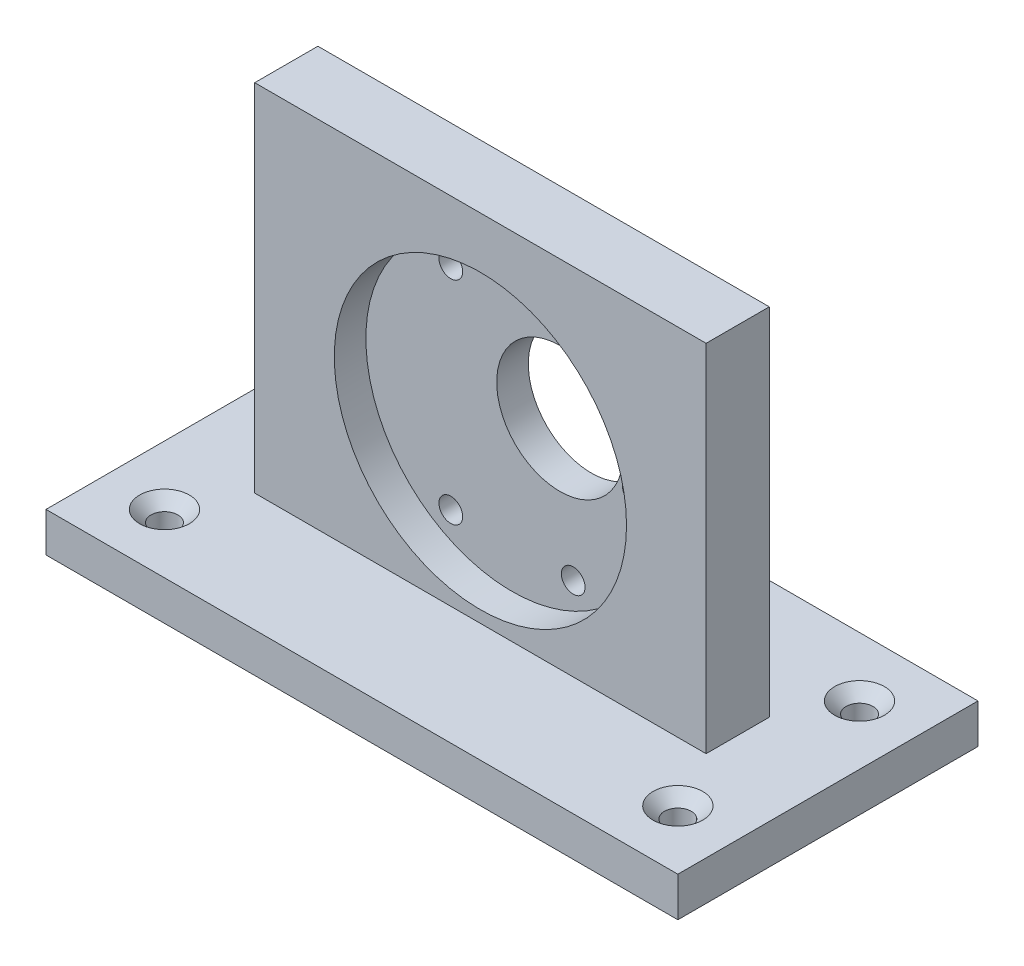
ISO-10303-21;
HEADER;
FILE_DESCRIPTION(('STEP AP214'),'2;1');
FILE_NAME('part.step','',(''),(''),'','','');
FILE_SCHEMA(('AUTOMOTIVE_DESIGN { 1 0 10303 214 1 1 1 1 }'));
ENDSEC;
DATA;
#1=APPLICATION_CONTEXT('core data for automotive mechanical design processes');
#2=APPLICATION_PROTOCOL_DEFINITION('international standard','automotive_design',2000,#1);
#3=PRODUCT_CONTEXT('',#1,'mechanical');
#4=PRODUCT('Part','Part','',(#3));
#5=PRODUCT_RELATED_PRODUCT_CATEGORY('part','',(#4));
#6=PRODUCT_DEFINITION_FORMATION('','',#4);
#7=PRODUCT_DEFINITION_CONTEXT('part definition',#1,'design');
#8=PRODUCT_DEFINITION('design','',#6,#7);
#9=PRODUCT_DEFINITION_SHAPE('','',#8);
#10=(LENGTH_UNIT() NAMED_UNIT(*) SI_UNIT(.MILLI.,.METRE.));
#11=(NAMED_UNIT(*) PLANE_ANGLE_UNIT() SI_UNIT($,.RADIAN.));
#12=(NAMED_UNIT(*) SI_UNIT($,.STERADIAN.) SOLID_ANGLE_UNIT());
#13=UNCERTAINTY_MEASURE_WITH_UNIT(LENGTH_MEASURE(1.E-05),#10,'distance_accuracy_value','');
#14=(GEOMETRIC_REPRESENTATION_CONTEXT(3) GLOBAL_UNCERTAINTY_ASSIGNED_CONTEXT((#13)) GLOBAL_UNIT_ASSIGNED_CONTEXT((#10,
#11,#12)) REPRESENTATION_CONTEXT('',''));
#15=CARTESIAN_POINT('',(0.,0.,0.));
#16=DIRECTION('',(0.,0.,1.));
#17=DIRECTION('',(1.,0.,0.));
#18=AXIS2_PLACEMENT_3D('',#15,#16,#17);
#19=CARTESIAN_POINT('',(-40.,5.,23.));
#20=DIRECTION('',(0.,-1.,0.));
#21=DIRECTION('',(1.,0.,0.));
#22=AXIS2_PLACEMENT_3D('',#19,#20,#21);
#23=PLANE('',#22);
#24=CARTESIAN_POINT('',(-32.5,5.,-7.5));
#25=DIRECTION('',(0.,1.,0.));
#26=DIRECTION('',(0.,0.,1.));
#27=AXIS2_PLACEMENT_3D('',#24,#25,#26);
#28=CIRCLE('',#27,3.15);
#29=CARTESIAN_POINT('',(-32.5,5.,-4.35));
#30=VERTEX_POINT('',#29);
#31=EDGE_CURVE('E146',#30,#30,#28,.T.);
#32=ORIENTED_EDGE('',*,*,#31,.F.);
#33=EDGE_LOOP('',(#32));
#34=FACE_BOUND('',#33,.T.);
#35=CARTESIAN_POINT('',(32.5,5.00000000000002,15.5));
#36=DIRECTION('',(0.,1.,0.));
#37=DIRECTION('',(0.,0.,1.));
#38=AXIS2_PLACEMENT_3D('',#35,#36,#37);
#39=CIRCLE('',#38,3.15);
#40=CARTESIAN_POINT('',(32.5,5.00000000000002,18.65));
#41=VERTEX_POINT('',#40);
#42=EDGE_CURVE('E154',#41,#41,#39,.T.);
#43=ORIENTED_EDGE('',*,*,#42,.F.);
#44=EDGE_LOOP('',(#43));
#45=FACE_BOUND('',#44,.T.);
#46=CARTESIAN_POINT('',(32.5,5.00000000000002,-7.5));
#47=DIRECTION('',(0.,1.,0.));
#48=DIRECTION('',(0.,0.,1.));
#49=AXIS2_PLACEMENT_3D('',#46,#47,#48);
#50=CIRCLE('',#49,3.15);
#51=CARTESIAN_POINT('',(32.5,5.00000000000002,-4.35));
#52=VERTEX_POINT('',#51);
#53=EDGE_CURVE('E163',#52,#52,#50,.T.);
#54=ORIENTED_EDGE('',*,*,#53,.F.);
#55=EDGE_LOOP('',(#54));
#56=FACE_BOUND('',#55,.T.);
#57=DIRECTION('',(0.,0.,-1.));
#58=VECTOR('',#57,1.);
#59=CARTESIAN_POINT('',(40.,5.00000000000002,23.));
#60=LINE('',#59,#58);
#61=CARTESIAN_POINT('',(40.,5.00000000000002,23.));
#62=VERTEX_POINT('',#61);
#63=CARTESIAN_POINT('',(40.,5.00000000000002,-15.));
#64=VERTEX_POINT('',#63);
#65=EDGE_CURVE('E195',#62,#64,#60,.T.);
#66=ORIENTED_EDGE('',*,*,#65,.T.);
#67=DIRECTION('',(-1.,0.,0.));
#68=VECTOR('',#67,1.);
#69=CARTESIAN_POINT('',(-40.,5.,-15.));
#70=LINE('',#69,#68);
#71=CARTESIAN_POINT('',(-40.,5.,-15.));
#72=VERTEX_POINT('',#71);
#73=EDGE_CURVE('E181',#64,#72,#70,.T.);
#74=ORIENTED_EDGE('',*,*,#73,.T.);
#75=DIRECTION('',(0.,0.,-1.));
#76=VECTOR('',#75,1.);
#77=CARTESIAN_POINT('',(-40.,5.,23.));
#78=LINE('',#77,#76);
#79=CARTESIAN_POINT('',(-40.,5.,23.));
#80=VERTEX_POINT('',#79);
#81=EDGE_CURVE('E193',#80,#72,#78,.T.);
#82=ORIENTED_EDGE('',*,*,#81,.F.);
#83=DIRECTION('',(-1.,0.,0.));
#84=VECTOR('',#83,1.);
#85=CARTESIAN_POINT('',(-40.,5.,23.));
#86=LINE('',#85,#84);
#87=EDGE_CURVE('E191',#62,#80,#86,.T.);
#88=ORIENTED_EDGE('',*,*,#87,.F.);
#89=EDGE_LOOP('',(#66,#74,#82,#88));
#90=FACE_BOUND('',#89,.T.);
#91=DIRECTION('',(0.,0.,-1.));
#92=VECTOR('',#91,1.);
#93=CARTESIAN_POINT('',(28.575,5.00000000000001,8.));
#94=LINE('',#93,#92);
#95=CARTESIAN_POINT('',(28.575,5.00000000000001,8.));
#96=VERTEX_POINT('',#95);
#97=CARTESIAN_POINT('',(28.575,5.00000000000001,0.));
#98=VERTEX_POINT('',#97);
#99=EDGE_CURVE('E201',#96,#98,#94,.T.);
#100=ORIENTED_EDGE('',*,*,#99,.F.);
#101=DIRECTION('',(-1.,0.,0.));
#102=VECTOR('',#101,1.);
#103=CARTESIAN_POINT('',(0.,5.00000000000001,8.));
#104=LINE('',#103,#102);
#105=CARTESIAN_POINT('',(-28.575,5.,8.));
#106=VERTEX_POINT('',#105);
#107=EDGE_CURVE('E206',#96,#106,#104,.T.);
#108=ORIENTED_EDGE('',*,*,#107,.T.);
#109=DIRECTION('',(0.,0.,-1.));
#110=VECTOR('',#109,1.);
#111=CARTESIAN_POINT('',(-28.575,5.,8.));
#112=LINE('',#111,#110);
#113=CARTESIAN_POINT('',(-28.575,5.,0.));
#114=VERTEX_POINT('',#113);
#115=EDGE_CURVE('E204',#106,#114,#112,.T.);
#116=ORIENTED_EDGE('',*,*,#115,.T.);
#117=DIRECTION('',(-1.,0.,0.));
#118=VECTOR('',#117,1.);
#119=CARTESIAN_POINT('',(0.,5.00000000000001,0.));
#120=LINE('',#119,#118);
#121=EDGE_CURVE('E55',#98,#114,#120,.T.);
#122=ORIENTED_EDGE('',*,*,#121,.F.);
#123=EDGE_LOOP('',(#100,#108,#116,#122));
#124=FACE_BOUND('',#123,.T.);
#125=CARTESIAN_POINT('',(-32.5,5.,15.5));
#126=DIRECTION('',(0.,1.,0.));
#127=DIRECTION('',(0.,0.,1.));
#128=AXIS2_PLACEMENT_3D('',#125,#126,#127);
#129=CIRCLE('',#128,3.15);
#130=CARTESIAN_POINT('',(-32.5,5.,18.65));
#131=VERTEX_POINT('',#130);
#132=EDGE_CURVE('E139',#131,#131,#129,.T.);
#133=ORIENTED_EDGE('',*,*,#132,.F.);
#134=EDGE_LOOP('',(#133));
#135=FACE_BOUND('',#134,.T.);
#136=ADVANCED_FACE('F47',(#34,#45,#56,#90,#124,#135),#23,.F.);
#137=CARTESIAN_POINT('',(-28.575,50.,8.));
#138=DIRECTION('',(1.,0.,0.));
#139=DIRECTION('',(0.,1.,0.));
#140=AXIS2_PLACEMENT_3D('',#137,#138,#139);
#141=PLANE('',#140);
#142=ORIENTED_EDGE('',*,*,#115,.F.);
#143=DIRECTION('',(0.,-1.,0.));
#144=VECTOR('',#143,1.);
#145=CARTESIAN_POINT('',(-28.575,50.,8.));
#146=LINE('',#145,#144);
#147=CARTESIAN_POINT('',(-28.575,50.,8.));
#148=VERTEX_POINT('',#147);
#149=EDGE_CURVE('E256',#148,#106,#146,.T.);
#150=ORIENTED_EDGE('',*,*,#149,.F.);
#151=DIRECTION('',(0.,0.,-1.));
#152=VECTOR('',#151,1.);
#153=CARTESIAN_POINT('',(-28.575,50.,8.));
#154=LINE('',#153,#152);
#155=CARTESIAN_POINT('',(-28.575,50.,0.));
#156=VERTEX_POINT('',#155);
#157=EDGE_CURVE('E267',#148,#156,#154,.T.);
#158=ORIENTED_EDGE('',*,*,#157,.T.);
#159=DIRECTION('',(0.,-1.,0.));
#160=VECTOR('',#159,1.);
#161=CARTESIAN_POINT('',(-28.575,50.,0.));
#162=LINE('',#161,#160);
#163=EDGE_CURVE('E253',#156,#114,#162,.T.);
#164=ORIENTED_EDGE('',*,*,#163,.T.);
#165=EDGE_LOOP('',(#142,#150,#158,#164));
#166=FACE_BOUND('',#165,.T.);
#167=ADVANCED_FACE('F280',(#166),#141,.F.);
#168=CARTESIAN_POINT('',(28.575,50.,8.));
#169=DIRECTION('',(1.,0.,0.));
#170=DIRECTION('',(0.,1.,0.));
#171=AXIS2_PLACEMENT_3D('',#168,#169,#170);
#172=PLANE('',#171);
#173=DIRECTION('',(0.,-1.,0.));
#174=VECTOR('',#173,1.);
#175=CARTESIAN_POINT('',(28.575,50.,8.));
#176=LINE('',#175,#174);
#177=CARTESIAN_POINT('',(28.575,50.,8.));
#178=VERTEX_POINT('',#177);
#179=EDGE_CURVE('E252',#178,#96,#176,.T.);
#180=ORIENTED_EDGE('',*,*,#179,.T.);
#181=ORIENTED_EDGE('',*,*,#99,.T.);
#182=DIRECTION('',(0.,-1.,0.));
#183=VECTOR('',#182,1.);
#184=CARTESIAN_POINT('',(28.575,50.,0.));
#185=LINE('',#184,#183);
#186=CARTESIAN_POINT('',(28.575,50.,0.));
#187=VERTEX_POINT('',#186);
#188=EDGE_CURVE('E262',#187,#98,#185,.T.);
#189=ORIENTED_EDGE('',*,*,#188,.F.);
#190=DIRECTION('',(0.,0.,-1.));
#191=VECTOR('',#190,1.);
#192=CARTESIAN_POINT('',(28.575,50.,8.));
#193=LINE('',#192,#191);
#194=EDGE_CURVE('E259',#178,#187,#193,.T.);
#195=ORIENTED_EDGE('',*,*,#194,.F.);
#196=EDGE_LOOP('',(#180,#181,#189,#195));
#197=FACE_BOUND('',#196,.T.);
#198=ADVANCED_FACE('F286',(#197),#172,.T.);
#199=CARTESIAN_POINT('',(0.,0.,8.));
#200=DIRECTION('',(0.,0.,-1.));
#201=DIRECTION('',(-1.,0.,0.));
#202=AXIS2_PLACEMENT_3D('',#199,#200,#201);
#203=PLANE('',#202);
#204=CARTESIAN_POINT('',(0.,25.,8.));
#205=DIRECTION('',(0.,0.,1.));
#206=DIRECTION('',(1.,0.,0.));
#207=AXIS2_PLACEMENT_3D('',#204,#205,#206);
#208=CIRCLE('',#207,18.5);
#209=CARTESIAN_POINT('',(18.5,25.,8.));
#210=VERTEX_POINT('',#209);
#211=EDGE_CURVE('E208',#210,#210,#208,.T.);
#212=ORIENTED_EDGE('',*,*,#211,.F.);
#213=EDGE_LOOP('',(#212));
#214=FACE_BOUND('',#213,.T.);
#215=ORIENTED_EDGE('',*,*,#107,.F.);
#216=ORIENTED_EDGE('',*,*,#179,.F.);
#217=DIRECTION('',(1.,0.,0.));
#218=VECTOR('',#217,1.);
#219=CARTESIAN_POINT('',(-28.575,50.,8.));
#220=LINE('',#219,#218);
#221=EDGE_CURVE('E249',#148,#178,#220,.T.);
#222=ORIENTED_EDGE('',*,*,#221,.F.);
#223=ORIENTED_EDGE('',*,*,#149,.T.);
#224=EDGE_LOOP('',(#215,#216,#222,#223));
#225=FACE_BOUND('',#224,.T.);
#226=ADVANCED_FACE('F290',(#214,#225),#203,.F.);
#227=CARTESIAN_POINT('',(0.,0.,0.));
#228=DIRECTION('',(0.,0.,-1.));
#229=DIRECTION('',(-1.,0.,0.));
#230=AXIS2_PLACEMENT_3D('',#227,#228,#229);
#231=PLANE('',#230);
#232=CARTESIAN_POINT('',(-20.3378221746704,28.4999999993294,0.));
#233=DIRECTION('',(0.,0.,-1.));
#234=DIRECTION('',(-1.,0.,0.));
#235=AXIS2_PLACEMENT_3D('',#232,#233,#234);
#236=CIRCLE('',#235,6.985);
#237=CARTESIAN_POINT('',(-27.3228221746704,28.4999999993294,0.));
#238=VERTEX_POINT('',#237);
#239=EDGE_CURVE('E705',#238,#238,#236,.T.);
#240=ORIENTED_EDGE('',*,*,#239,.F.);
#241=EDGE_LOOP('',(#240));
#242=FACE_BOUND('',#241,.T.);
#243=CARTESIAN_POINT('',(-7.74999999999999,38.4233937586588,0.));
#244=DIRECTION('',(0.,0.,1.));
#245=DIRECTION('',(1.,0.,0.));
#246=AXIS2_PLACEMENT_3D('',#243,#244,#245);
#247=CIRCLE('',#246,1.50000000039213);
#248=CARTESIAN_POINT('',(-6.24999999960786,38.4233937586588,0.));
#249=VERTEX_POINT('',#248);
#250=EDGE_CURVE('E234',#249,#249,#247,.T.);
#251=ORIENTED_EDGE('',*,*,#250,.T.);
#252=EDGE_LOOP('',(#251));
#253=FACE_BOUND('',#252,.T.);
#254=CARTESIAN_POINT('',(-7.74999999999999,11.5766062413412,0.));
#255=DIRECTION('',(0.,0.,1.));
#256=DIRECTION('',(1.,0.,0.));
#257=AXIS2_PLACEMENT_3D('',#254,#255,#256);
#258=CIRCLE('',#257,1.50000000039213);
#259=CARTESIAN_POINT('',(-6.24999999960786,11.5766062413412,0.));
#260=VERTEX_POINT('',#259);
#261=EDGE_CURVE('E238',#260,#260,#258,.T.);
#262=ORIENTED_EDGE('',*,*,#261,.T.);
#263=EDGE_LOOP('',(#262));
#264=FACE_BOUND('',#263,.T.);
#265=CARTESIAN_POINT('',(7.75000000000001,11.5766062413412,0.));
#266=DIRECTION('',(0.,0.,1.));
#267=DIRECTION('',(1.,0.,0.));
#268=AXIS2_PLACEMENT_3D('',#265,#266,#267);
#269=CIRCLE('',#268,1.50000000039213);
#270=CARTESIAN_POINT('',(9.25000000039214,11.5766062413412,0.));
#271=VERTEX_POINT('',#270);
#272=EDGE_CURVE('E241',#271,#271,#269,.T.);
#273=ORIENTED_EDGE('',*,*,#272,.T.);
#274=EDGE_LOOP('',(#273));
#275=FACE_BOUND('',#274,.T.);
#276=CARTESIAN_POINT('',(15.5,25.,0.));
#277=DIRECTION('',(0.,0.,1.));
#278=DIRECTION('',(1.,0.,0.));
#279=AXIS2_PLACEMENT_3D('',#276,#277,#278);
#280=CIRCLE('',#279,1.50000000039213);
#281=CARTESIAN_POINT('',(17.0000000003921,25.,0.));
#282=VERTEX_POINT('',#281);
#283=EDGE_CURVE('E233',#282,#282,#280,.T.);
#284=ORIENTED_EDGE('',*,*,#283,.T.);
#285=EDGE_LOOP('',(#284));
#286=FACE_BOUND('',#285,.T.);
#287=CARTESIAN_POINT('',(6.06217782532956,28.4999999993294,0.));
#288=DIRECTION('',(0.,0.,1.));
#289=DIRECTION('',(1.,0.,0.));
#290=AXIS2_PLACEMENT_3D('',#287,#288,#289);
#291=CIRCLE('',#290,8.00000000000001);
#292=CARTESIAN_POINT('',(14.0621778253296,28.4999999993294,0.));
#293=VERTEX_POINT('',#292);
#294=EDGE_CURVE('E230',#293,#293,#291,.T.);
#295=ORIENTED_EDGE('',*,*,#294,.T.);
#296=EDGE_LOOP('',(#295));
#297=FACE_BOUND('',#296,.T.);
#298=CARTESIAN_POINT('',(7.74999999999999,38.4233937586588,0.));
#299=DIRECTION('',(0.,0.,1.));
#300=DIRECTION('',(1.,0.,0.));
#301=AXIS2_PLACEMENT_3D('',#298,#299,#300);
#302=CIRCLE('',#301,1.50000000039214);
#303=CARTESIAN_POINT('',(9.25000000039213,38.4233937586588,0.));
#304=VERTEX_POINT('',#303);
#305=EDGE_CURVE('E237',#304,#304,#302,.T.);
#306=ORIENTED_EDGE('',*,*,#305,.T.);
#307=EDGE_LOOP('',(#306));
#308=FACE_BOUND('',#307,.T.);
#309=ORIENTED_EDGE('',*,*,#188,.T.);
#310=ORIENTED_EDGE('',*,*,#121,.T.);
#311=ORIENTED_EDGE('',*,*,#163,.F.);
#312=DIRECTION('',(1.,0.,0.));
#313=VECTOR('',#312,1.);
#314=CARTESIAN_POINT('',(-28.575,50.,0.));
#315=LINE('',#314,#313);
#316=EDGE_CURVE('E248',#156,#187,#315,.T.);
#317=ORIENTED_EDGE('',*,*,#316,.T.);
#318=EDGE_LOOP('',(#309,#310,#311,#317));
#319=FACE_BOUND('',#318,.T.);
#320=ADVANCED_FACE('F274',(#242,#253,#264,#275,#286,#297,#308,#319),#231,.T.);
#321=CARTESIAN_POINT('',(7.74999999999999,38.4233937586588,10.));
#322=DIRECTION('',(0.,0.,-1.));
#323=DIRECTION('',(-1.,0.,0.));
#324=AXIS2_PLACEMENT_3D('',#321,#322,#323);
#325=CYLINDRICAL_SURFACE('',#324,1.50000000039214);
#326=ORIENTED_EDGE('',*,*,#305,.F.);
#327=EDGE_LOOP('',(#326));
#328=FACE_BOUND('',#327,.T.);
#329=CARTESIAN_POINT('',(7.74999999999999,38.4233937586588,4.));
#330=DIRECTION('',(0.,0.,1.));
#331=DIRECTION('',(1.,0.,0.));
#332=AXIS2_PLACEMENT_3D('',#329,#330,#331);
#333=CIRCLE('',#332,1.50000000039214);
#334=CARTESIAN_POINT('',(9.25000000039213,38.4233937586588,4.));
#335=VERTEX_POINT('',#334);
#336=EDGE_CURVE('E227',#335,#335,#333,.T.);
#337=ORIENTED_EDGE('',*,*,#336,.T.);
#338=EDGE_LOOP('',(#337));
#339=FACE_BOUND('',#338,.T.);
#340=ADVANCED_FACE('F298',(#328,#339),#325,.F.);
#341=CARTESIAN_POINT('',(6.06217782532956,28.4999999993294,10.));
#342=DIRECTION('',(0.,0.,-1.));
#343=DIRECTION('',(-1.,0.,0.));
#344=AXIS2_PLACEMENT_3D('',#341,#342,#343);
#345=CYLINDRICAL_SURFACE('',#344,8.00000000000001);
#346=ORIENTED_EDGE('',*,*,#294,.F.);
#347=EDGE_LOOP('',(#346));
#348=FACE_BOUND('',#347,.T.);
#349=CARTESIAN_POINT('',(6.06217782532956,28.4999999993294,4.));
#350=DIRECTION('',(0.,0.,1.));
#351=DIRECTION('',(1.,0.,0.));
#352=AXIS2_PLACEMENT_3D('',#349,#350,#351);
#353=CIRCLE('',#352,8.00000000000001);
#354=CARTESIAN_POINT('',(14.0621778253296,28.4999999993294,4.));
#355=VERTEX_POINT('',#354);
#356=EDGE_CURVE('E224',#355,#355,#353,.T.);
#357=ORIENTED_EDGE('',*,*,#356,.T.);
#358=EDGE_LOOP('',(#357));
#359=FACE_BOUND('',#358,.T.);
#360=ADVANCED_FACE('F332',(#348,#359),#345,.F.);
#361=CARTESIAN_POINT('',(15.5,25.,10.));
#362=DIRECTION('',(0.,0.,-1.));
#363=DIRECTION('',(-1.,0.,0.));
#364=AXIS2_PLACEMENT_3D('',#361,#362,#363);
#365=CYLINDRICAL_SURFACE('',#364,1.50000000039213);
#366=ORIENTED_EDGE('',*,*,#283,.F.);
#367=EDGE_LOOP('',(#366));
#368=FACE_BOUND('',#367,.T.);
#369=CARTESIAN_POINT('',(15.5,25.,4.));
#370=DIRECTION('',(0.,0.,1.));
#371=DIRECTION('',(1.,0.,0.));
#372=AXIS2_PLACEMENT_3D('',#369,#370,#371);
#373=CIRCLE('',#372,1.50000000039213);
#374=CARTESIAN_POINT('',(17.0000000003921,25.,4.));
#375=VERTEX_POINT('',#374);
#376=EDGE_CURVE('E221',#375,#375,#373,.T.);
#377=ORIENTED_EDGE('',*,*,#376,.T.);
#378=EDGE_LOOP('',(#377));
#379=FACE_BOUND('',#378,.T.);
#380=ADVANCED_FACE('F335',(#368,#379),#365,.F.);
#381=CARTESIAN_POINT('',(7.75000000000001,11.5766062413412,10.));
#382=DIRECTION('',(0.,0.,-1.));
#383=DIRECTION('',(-1.,0.,0.));
#384=AXIS2_PLACEMENT_3D('',#381,#382,#383);
#385=CYLINDRICAL_SURFACE('',#384,1.50000000039213);
#386=ORIENTED_EDGE('',*,*,#272,.F.);
#387=EDGE_LOOP('',(#386));
#388=FACE_BOUND('',#387,.T.);
#389=CARTESIAN_POINT('',(7.75000000000001,11.5766062413412,4.));
#390=DIRECTION('',(0.,0.,1.));
#391=DIRECTION('',(1.,0.,0.));
#392=AXIS2_PLACEMENT_3D('',#389,#390,#391);
#393=CIRCLE('',#392,1.50000000039213);
#394=CARTESIAN_POINT('',(9.25000000039214,11.5766062413412,4.));
#395=VERTEX_POINT('',#394);
#396=EDGE_CURVE('E218',#395,#395,#393,.T.);
#397=ORIENTED_EDGE('',*,*,#396,.T.);
#398=EDGE_LOOP('',(#397));
#399=FACE_BOUND('',#398,.T.);
#400=ADVANCED_FACE('F344',(#388,#399),#385,.F.);
#401=CARTESIAN_POINT('',(-7.74999999999999,11.5766062413412,10.));
#402=DIRECTION('',(0.,0.,-1.));
#403=DIRECTION('',(-1.,0.,0.));
#404=AXIS2_PLACEMENT_3D('',#401,#402,#403);
#405=CYLINDRICAL_SURFACE('',#404,1.50000000039213);
#406=ORIENTED_EDGE('',*,*,#261,.F.);
#407=EDGE_LOOP('',(#406));
#408=FACE_BOUND('',#407,.T.);
#409=CARTESIAN_POINT('',(-7.74999999999999,11.5766062413412,4.));
#410=DIRECTION('',(0.,0.,1.));
#411=DIRECTION('',(1.,0.,0.));
#412=AXIS2_PLACEMENT_3D('',#409,#410,#411);
#413=CIRCLE('',#412,1.50000000039213);
#414=CARTESIAN_POINT('',(-6.24999999960786,11.5766062413412,4.));
#415=VERTEX_POINT('',#414);
#416=EDGE_CURVE('E215',#415,#415,#413,.T.);
#417=ORIENTED_EDGE('',*,*,#416,.T.);
#418=EDGE_LOOP('',(#417));
#419=FACE_BOUND('',#418,.T.);
#420=ADVANCED_FACE('F340',(#408,#419),#405,.F.);
#421=CARTESIAN_POINT('',(-7.74999999999999,38.4233937586588,10.));
#422=DIRECTION('',(0.,0.,-1.));
#423=DIRECTION('',(-1.,0.,0.));
#424=AXIS2_PLACEMENT_3D('',#421,#422,#423);
#425=CYLINDRICAL_SURFACE('',#424,1.50000000039213);
#426=ORIENTED_EDGE('',*,*,#250,.F.);
#427=EDGE_LOOP('',(#426));
#428=FACE_BOUND('',#427,.T.);
#429=CARTESIAN_POINT('',(-7.74999999999999,38.4233937586588,4.));
#430=DIRECTION('',(0.,0.,1.));
#431=DIRECTION('',(1.,0.,0.));
#432=AXIS2_PLACEMENT_3D('',#429,#430,#431);
#433=CIRCLE('',#432,1.50000000039213);
#434=CARTESIAN_POINT('',(-6.24999999960786,38.4233937586588,4.));
#435=VERTEX_POINT('',#434);
#436=EDGE_CURVE('E212',#435,#435,#433,.T.);
#437=ORIENTED_EDGE('',*,*,#436,.T.);
#438=EDGE_LOOP('',(#437));
#439=FACE_BOUND('',#438,.T.);
#440=ADVANCED_FACE('F337',(#428,#439),#425,.F.);
#441=CARTESIAN_POINT('',(-28.575,50.,8.));
#442=DIRECTION('',(0.,1.,0.));
#443=DIRECTION('',(-1.,0.,0.));
#444=AXIS2_PLACEMENT_3D('',#441,#442,#443);
#445=PLANE('',#444);
#446=ORIENTED_EDGE('',*,*,#316,.F.);
#447=ORIENTED_EDGE('',*,*,#157,.F.);
#448=ORIENTED_EDGE('',*,*,#221,.T.);
#449=ORIENTED_EDGE('',*,*,#194,.T.);
#450=EDGE_LOOP('',(#446,#447,#448,#449));
#451=FACE_BOUND('',#450,.T.);
#452=ADVANCED_FACE('F49',(#451),#445,.T.);
#453=CARTESIAN_POINT('',(0.,25.,4.));
#454=DIRECTION('',(0.,0.,1.));
#455=DIRECTION('',(1.,0.,0.));
#456=AXIS2_PLACEMENT_3D('',#453,#454,#455);
#457=CYLINDRICAL_SURFACE('',#456,18.5);
#458=CARTESIAN_POINT('',(0.,25.,4.));
#459=DIRECTION('',(0.,0.,1.));
#460=DIRECTION('',(1.,0.,0.));
#461=AXIS2_PLACEMENT_3D('',#458,#459,#460);
#462=CIRCLE('',#461,18.5);
#463=CARTESIAN_POINT('',(18.5,25.,4.));
#464=VERTEX_POINT('',#463);
#465=EDGE_CURVE('E209',#464,#464,#462,.T.);
#466=ORIENTED_EDGE('',*,*,#465,.F.);
#467=EDGE_LOOP('',(#466));
#468=FACE_BOUND('',#467,.T.);
#469=ORIENTED_EDGE('',*,*,#211,.T.);
#470=EDGE_LOOP('',(#469));
#471=FACE_BOUND('',#470,.T.);
#472=ADVANCED_FACE('F327',(#468,#471),#457,.F.);
#473=CARTESIAN_POINT('',(0.,25.,4.));
#474=DIRECTION('',(0.,0.,1.));
#475=DIRECTION('',(1.,0.,0.));
#476=AXIS2_PLACEMENT_3D('',#473,#474,#475);
#477=PLANE('',#476);
#478=ORIENTED_EDGE('',*,*,#336,.F.);
#479=EDGE_LOOP('',(#478));
#480=FACE_BOUND('',#479,.T.);
#481=ORIENTED_EDGE('',*,*,#356,.F.);
#482=EDGE_LOOP('',(#481));
#483=FACE_BOUND('',#482,.T.);
#484=ORIENTED_EDGE('',*,*,#376,.F.);
#485=EDGE_LOOP('',(#484));
#486=FACE_BOUND('',#485,.T.);
#487=ORIENTED_EDGE('',*,*,#396,.F.);
#488=EDGE_LOOP('',(#487));
#489=FACE_BOUND('',#488,.T.);
#490=ORIENTED_EDGE('',*,*,#416,.F.);
#491=EDGE_LOOP('',(#490));
#492=FACE_BOUND('',#491,.T.);
#493=ORIENTED_EDGE('',*,*,#436,.F.);
#494=EDGE_LOOP('',(#493));
#495=FACE_BOUND('',#494,.T.);
#496=ORIENTED_EDGE('',*,*,#465,.T.);
#497=EDGE_LOOP('',(#496));
#498=FACE_BOUND('',#497,.T.);
#499=ADVANCED_FACE('F323',(#480,#483,#486,#489,#492,#495,#498),#477,.T.);
#500=CARTESIAN_POINT('',(-40.,5.,23.));
#501=DIRECTION('',(1.,0.,0.));
#502=DIRECTION('',(0.,0.,-1.));
#503=AXIS2_PLACEMENT_3D('',#500,#501,#502);
#504=PLANE('',#503);
#505=ORIENTED_EDGE('',*,*,#81,.T.);
#506=DIRECTION('',(0.,-1.,0.));
#507=VECTOR('',#506,1.);
#508=CARTESIAN_POINT('',(-40.,5.,-15.));
#509=LINE('',#508,#507);
#510=CARTESIAN_POINT('',(-40.,0.,-15.));
#511=VERTEX_POINT('',#510);
#512=EDGE_CURVE('E172',#72,#511,#509,.T.);
#513=ORIENTED_EDGE('',*,*,#512,.T.);
#514=DIRECTION('',(0.,0.,-1.));
#515=VECTOR('',#514,1.);
#516=CARTESIAN_POINT('',(-40.,0.,23.));
#517=LINE('',#516,#515);
#518=CARTESIAN_POINT('',(-40.,0.,23.));
#519=VERTEX_POINT('',#518);
#520=EDGE_CURVE('E199',#519,#511,#517,.T.);
#521=ORIENTED_EDGE('',*,*,#520,.F.);
#522=DIRECTION('',(0.,-1.,0.));
#523=VECTOR('',#522,1.);
#524=CARTESIAN_POINT('',(-40.,5.,23.));
#525=LINE('',#524,#523);
#526=EDGE_CURVE('E184',#80,#519,#525,.T.);
#527=ORIENTED_EDGE('',*,*,#526,.F.);
#528=EDGE_LOOP('',(#505,#513,#521,#527));
#529=FACE_BOUND('',#528,.T.);
#530=ADVANCED_FACE('F319',(#529),#504,.F.);
#531=CARTESIAN_POINT('',(40.,5.00000000000002,23.));
#532=DIRECTION('',(-1.,0.,0.));
#533=DIRECTION('',(0.,0.,1.));
#534=AXIS2_PLACEMENT_3D('',#531,#532,#533);
#535=PLANE('',#534);
#536=DIRECTION('',(0.,0.,-1.));
#537=VECTOR('',#536,1.);
#538=CARTESIAN_POINT('',(40.,0.,23.));
#539=LINE('',#538,#537);
#540=CARTESIAN_POINT('',(40.,0.,23.));
#541=VERTEX_POINT('',#540);
#542=CARTESIAN_POINT('',(40.,0.,-15.));
#543=VERTEX_POINT('',#542);
#544=EDGE_CURVE('E197',#541,#543,#539,.T.);
#545=ORIENTED_EDGE('',*,*,#544,.T.);
#546=DIRECTION('',(0.,1.,0.));
#547=VECTOR('',#546,1.);
#548=CARTESIAN_POINT('',(40.,5.00000000000002,-15.));
#549=LINE('',#548,#547);
#550=EDGE_CURVE('E178',#543,#64,#549,.T.);
#551=ORIENTED_EDGE('',*,*,#550,.T.);
#552=ORIENTED_EDGE('',*,*,#65,.F.);
#553=DIRECTION('',(0.,1.,0.));
#554=VECTOR('',#553,1.);
#555=CARTESIAN_POINT('',(40.,5.00000000000002,23.));
#556=LINE('',#555,#554);
#557=EDGE_CURVE('E189',#541,#62,#556,.T.);
#558=ORIENTED_EDGE('',*,*,#557,.F.);
#559=EDGE_LOOP('',(#545,#551,#552,#558));
#560=FACE_BOUND('',#559,.T.);
#561=ADVANCED_FACE('F316',(#560),#535,.F.);
#562=CARTESIAN_POINT('',(0.,0.,23.));
#563=DIRECTION('',(0.,0.,1.));
#564=DIRECTION('',(1.,0.,0.));
#565=AXIS2_PLACEMENT_3D('',#562,#563,#564);
#566=PLANE('',#565);
#567=ORIENTED_EDGE('',*,*,#526,.T.);
#568=DIRECTION('',(1.,0.,0.));
#569=VECTOR('',#568,1.);
#570=CARTESIAN_POINT('',(-40.,0.,23.));
#571=LINE('',#570,#569);
#572=EDGE_CURVE('E187',#519,#541,#571,.T.);
#573=ORIENTED_EDGE('',*,*,#572,.T.);
#574=ORIENTED_EDGE('',*,*,#557,.T.);
#575=ORIENTED_EDGE('',*,*,#87,.T.);
#576=EDGE_LOOP('',(#567,#573,#574,#575));
#577=FACE_BOUND('',#576,.T.);
#578=ADVANCED_FACE('F314',(#577),#566,.T.);
#579=CARTESIAN_POINT('',(0.,0.,-15.));
#580=DIRECTION('',(0.,0.,1.));
#581=DIRECTION('',(1.,0.,0.));
#582=AXIS2_PLACEMENT_3D('',#579,#580,#581);
#583=PLANE('',#582);
#584=ORIENTED_EDGE('',*,*,#512,.F.);
#585=ORIENTED_EDGE('',*,*,#73,.F.);
#586=ORIENTED_EDGE('',*,*,#550,.F.);
#587=DIRECTION('',(1.,0.,0.));
#588=VECTOR('',#587,1.);
#589=CARTESIAN_POINT('',(-40.,0.,-15.));
#590=LINE('',#589,#588);
#591=EDGE_CURVE('E175',#511,#543,#590,.T.);
#592=ORIENTED_EDGE('',*,*,#591,.F.);
#593=EDGE_LOOP('',(#584,#585,#586,#592));
#594=FACE_BOUND('',#593,.T.);
#595=ADVANCED_FACE('F427',(#594),#583,.F.);
#596=CARTESIAN_POINT('',(-28.575,0.,8.));
#597=DIRECTION('',(0.,1.,0.));
#598=DIRECTION('',(-1.,0.,0.));
#599=AXIS2_PLACEMENT_3D('',#596,#597,#598);
#600=PLANE('',#599);
#601=CARTESIAN_POINT('',(-32.5,0.,-7.5));
#602=DIRECTION('',(0.,1.,0.));
#603=DIRECTION('',(0.,0.,1.));
#604=AXIS2_PLACEMENT_3D('',#601,#602,#603);
#605=CIRCLE('',#604,1.69999999999999);
#606=CARTESIAN_POINT('',(-32.9036495479958,0.,-5.8486166276716));
#607=VERTEX_POINT('',#606);
#608=CARTESIAN_POINT('',(-32.9870959921775,0.,-9.12872265730069));
#609=VERTEX_POINT('',#608);
#610=EDGE_CURVE('E134',#607,#609,#605,.T.);
#611=ORIENTED_EDGE('',*,*,#610,.T.);
#612=CARTESIAN_POINT('',(-33.3910360725576,0.,-7.47733189377985));
#613=DIRECTION('',(0.,1.,0.));
#614=DIRECTION('',(0.999676555950965,0.,-0.0254319382276978));
#615=AXIS2_PLACEMENT_3D('',#612,#613,#614);
#616=ELLIPSE('',#615,1.70110897002667,1.69999999999995);
#617=EDGE_CURVE('E129',#609,#607,#616,.T.);
#618=ORIENTED_EDGE('',*,*,#617,.T.);
#619=EDGE_LOOP('',(#611,#618));
#620=FACE_BOUND('',#619,.T.);
#621=CARTESIAN_POINT('',(-32.5,0.,15.5));
#622=DIRECTION('',(0.,1.,0.));
#623=DIRECTION('',(0.,0.,1.));
#624=AXIS2_PLACEMENT_3D('',#621,#622,#623);
#625=CIRCLE('',#624,1.69999999999999);
#626=CARTESIAN_POINT('',(-32.3175387253942,0.,17.1901798375526));
#627=VERTEX_POINT('',#626);
#628=CARTESIAN_POINT('',(-32.4037160435226,0.,13.8027288373024));
#629=VERTEX_POINT('',#628);
#630=EDGE_CURVE('E152',#627,#629,#625,.T.);
#631=ORIENTED_EDGE('',*,*,#630,.T.);
#632=EDGE_CURVE('E61',#629,#627,#625,.T.);
#633=ORIENTED_EDGE('',*,*,#632,.T.);
#634=EDGE_LOOP('',(#631,#633));
#635=FACE_BOUND('',#634,.T.);
#636=CARTESIAN_POINT('',(32.5,0.,15.5));
#637=DIRECTION('',(0.,1.,0.));
#638=DIRECTION('',(0.,0.,1.));
#639=AXIS2_PLACEMENT_3D('',#636,#637,#638);
#640=CIRCLE('',#639,1.69999999999999);
#641=CARTESIAN_POINT('',(32.5,0.,17.2));
#642=VERTEX_POINT('',#641);
#643=EDGE_CURVE('E160',#642,#642,#640,.T.);
#644=ORIENTED_EDGE('',*,*,#643,.T.);
#645=EDGE_LOOP('',(#644));
#646=FACE_BOUND('',#645,.T.);
#647=CARTESIAN_POINT('',(32.5,0.,-7.5));
#648=DIRECTION('',(0.,1.,0.));
#649=DIRECTION('',(0.,0.,1.));
#650=AXIS2_PLACEMENT_3D('',#647,#648,#649);
#651=CIRCLE('',#650,1.69999999999999);
#652=CARTESIAN_POINT('',(32.5,0.,-5.80000000000001));
#653=VERTEX_POINT('',#652);
#654=EDGE_CURVE('E169',#653,#653,#651,.T.);
#655=ORIENTED_EDGE('',*,*,#654,.T.);
#656=EDGE_LOOP('',(#655));
#657=FACE_BOUND('',#656,.T.);
#658=ORIENTED_EDGE('',*,*,#520,.T.);
#659=ORIENTED_EDGE('',*,*,#591,.T.);
#660=ORIENTED_EDGE('',*,*,#544,.F.);
#661=ORIENTED_EDGE('',*,*,#572,.F.);
#662=EDGE_LOOP('',(#658,#659,#660,#661));
#663=FACE_BOUND('',#662,.T.);
#664=ADVANCED_FACE('F133',(#620,#635,#646,#657,#663),#600,.F.);
#665=CARTESIAN_POINT('',(32.5,5.00000000000001,-7.5));
#666=DIRECTION('',(0.,1.,0.));
#667=DIRECTION('',(0.,0.,1.));
#668=AXIS2_PLACEMENT_3D('',#665,#666,#667);
#669=CYLINDRICAL_SURFACE('',#668,1.69999999999999);
#670=ORIENTED_EDGE('',*,*,#654,.F.);
#671=EDGE_LOOP('',(#670));
#672=FACE_BOUND('',#671,.T.);
#673=CARTESIAN_POINT('',(32.5,3.55000000000001,-7.5));
#674=DIRECTION('',(0.,1.,0.));
#675=DIRECTION('',(0.,0.,1.));
#676=AXIS2_PLACEMENT_3D('',#673,#674,#675);
#677=CIRCLE('',#676,1.69999999999999);
#678=CARTESIAN_POINT('',(32.5,3.55000000000001,-5.80000000000001));
#679=VERTEX_POINT('',#678);
#680=EDGE_CURVE('E166',#679,#679,#677,.T.);
#681=ORIENTED_EDGE('',*,*,#680,.T.);
#682=EDGE_LOOP('',(#681));
#683=FACE_BOUND('',#682,.T.);
#684=ADVANCED_FACE('F440',(#672,#683),#669,.F.);
#685=CARTESIAN_POINT('',(32.5,5.00000000000002,-7.5));
#686=DIRECTION('',(0.,1.,0.));
#687=DIRECTION('',(0.,0.,1.));
#688=AXIS2_PLACEMENT_3D('',#685,#686,#687);
#689=CONICAL_SURFACE('',#688,3.15,0.78539816339745);
#690=ORIENTED_EDGE('',*,*,#680,.F.);
#691=EDGE_LOOP('',(#690));
#692=FACE_BOUND('',#691,.T.);
#693=ORIENTED_EDGE('',*,*,#53,.T.);
#694=EDGE_LOOP('',(#693));
#695=FACE_BOUND('',#694,.T.);
#696=ADVANCED_FACE('F449',(#692,#695),#689,.F.);
#697=CARTESIAN_POINT('',(32.5,5.00000000000001,15.5));
#698=DIRECTION('',(0.,1.,0.));
#699=DIRECTION('',(0.,0.,1.));
#700=AXIS2_PLACEMENT_3D('',#697,#698,#699);
#701=CYLINDRICAL_SURFACE('',#700,1.69999999999999);
#702=ORIENTED_EDGE('',*,*,#643,.F.);
#703=EDGE_LOOP('',(#702));
#704=FACE_BOUND('',#703,.T.);
#705=CARTESIAN_POINT('',(32.5,3.55000000000001,15.5));
#706=DIRECTION('',(0.,1.,0.));
#707=DIRECTION('',(0.,0.,1.));
#708=AXIS2_PLACEMENT_3D('',#705,#706,#707);
#709=CIRCLE('',#708,1.69999999999999);
#710=CARTESIAN_POINT('',(32.5,3.55000000000001,17.2));
#711=VERTEX_POINT('',#710);
#712=EDGE_CURVE('E157',#711,#711,#709,.T.);
#713=ORIENTED_EDGE('',*,*,#712,.T.);
#714=EDGE_LOOP('',(#713));
#715=FACE_BOUND('',#714,.T.);
#716=ADVANCED_FACE('F457',(#704,#715),#701,.F.);
#717=CARTESIAN_POINT('',(32.5,5.00000000000002,15.5));
#718=DIRECTION('',(0.,1.,0.));
#719=DIRECTION('',(0.,0.,1.));
#720=AXIS2_PLACEMENT_3D('',#717,#718,#719);
#721=CONICAL_SURFACE('',#720,3.15,0.78539816339745);
#722=ORIENTED_EDGE('',*,*,#712,.F.);
#723=EDGE_LOOP('',(#722));
#724=FACE_BOUND('',#723,.T.);
#725=ORIENTED_EDGE('',*,*,#42,.T.);
#726=EDGE_LOOP('',(#725));
#727=FACE_BOUND('',#726,.T.);
#728=ADVANCED_FACE('F465',(#724,#727),#721,.F.);
#729=CARTESIAN_POINT('',(-32.5,5.,15.5));
#730=DIRECTION('',(0.,1.,0.));
#731=DIRECTION('',(0.,0.,1.));
#732=AXIS2_PLACEMENT_3D('',#729,#730,#731);
#733=CYLINDRICAL_SURFACE('',#732,1.69999999999999);
#734=ORIENTED_EDGE('',*,*,#630,.F.);
#735=ORIENTED_EDGE('',*,*,#632,.F.);
#736=EDGE_LOOP('',(#734,#735));
#737=FACE_BOUND('',#736,.T.);
#738=CARTESIAN_POINT('',(-32.5,3.54999999999999,15.5));
#739=DIRECTION('',(0.,1.,0.));
#740=DIRECTION('',(0.,0.,1.));
#741=AXIS2_PLACEMENT_3D('',#738,#739,#740);
#742=CIRCLE('',#741,1.69999999999999);
#743=CARTESIAN_POINT('',(-32.5,3.54999999999999,17.2));
#744=VERTEX_POINT('',#743);
#745=EDGE_CURVE('E143',#744,#744,#742,.T.);
#746=ORIENTED_EDGE('',*,*,#745,.T.);
#747=EDGE_LOOP('',(#746));
#748=FACE_BOUND('',#747,.T.);
#749=ADVANCED_FACE('F473',(#737,#748),#733,.F.);
#750=CARTESIAN_POINT('',(-32.5,5.,15.5));
#751=DIRECTION('',(0.,1.,0.));
#752=DIRECTION('',(0.,0.,1.));
#753=AXIS2_PLACEMENT_3D('',#750,#751,#752);
#754=CONICAL_SURFACE('',#753,3.15,0.78539816339745);
#755=ORIENTED_EDGE('',*,*,#745,.F.);
#756=EDGE_LOOP('',(#755));
#757=FACE_BOUND('',#756,.T.);
#758=ORIENTED_EDGE('',*,*,#132,.T.);
#759=EDGE_LOOP('',(#758));
#760=FACE_BOUND('',#759,.T.);
#761=ADVANCED_FACE('F481',(#757,#760),#754,.F.);
#762=CARTESIAN_POINT('',(-32.5,5.,-7.5));
#763=DIRECTION('',(0.,1.,0.));
#764=DIRECTION('',(0.,0.,1.));
#765=AXIS2_PLACEMENT_3D('',#762,#763,#764);
#766=CYLINDRICAL_SURFACE('',#765,1.69999999999999);
#767=ORIENTED_EDGE('',*,*,#610,.F.);
#768=CARTESIAN_POINT('',(-32.5,-0.016094793527521,-7.5));
#769=DIRECTION('',(0.0360908865319122,0.999348089954104,-0.000918158169658495));
#770=DIRECTION('',(-0.999024856761494,0.036102563691293,0.0254153588916807));
#771=AXIS2_PLACEMENT_3D('',#768,#769,#770);
#772=ELLIPSE('',#771,1.70110897002671,1.69999999999999);
#773=EDGE_CURVE('E12',#607,#609,#772,.F.);
#774=ORIENTED_EDGE('',*,*,#773,.T.);
#775=EDGE_LOOP('',(#767,#774));
#776=FACE_BOUND('',#775,.T.);
#777=CARTESIAN_POINT('',(-32.5,3.54999999999999,-7.5));
#778=DIRECTION('',(0.,1.,0.));
#779=DIRECTION('',(0.,0.,1.));
#780=AXIS2_PLACEMENT_3D('',#777,#778,#779);
#781=CIRCLE('',#780,1.69999999999999);
#782=CARTESIAN_POINT('',(-32.5,3.54999999999999,-5.80000000000001));
#783=VERTEX_POINT('',#782);
#784=EDGE_CURVE('E140',#783,#783,#781,.T.);
#785=ORIENTED_EDGE('',*,*,#784,.T.);
#786=EDGE_LOOP('',(#785));
#787=FACE_BOUND('',#786,.T.);
#788=ADVANCED_FACE('F137',(#776,#787),#766,.F.);
#789=CARTESIAN_POINT('',(-32.5,5.,-7.5));
#790=DIRECTION('',(0.,1.,0.));
#791=DIRECTION('',(0.,0.,1.));
#792=AXIS2_PLACEMENT_3D('',#789,#790,#791);
#793=CONICAL_SURFACE('',#792,3.15,0.78539816339745);
#794=ORIENTED_EDGE('',*,*,#784,.F.);
#795=EDGE_LOOP('',(#794));
#796=FACE_BOUND('',#795,.T.);
#797=ORIENTED_EDGE('',*,*,#31,.T.);
#798=EDGE_LOOP('',(#797));
#799=FACE_BOUND('',#798,.T.);
#800=ADVANCED_FACE('F495',(#796,#799),#793,.F.);
#801=CARTESIAN_POINT('',(-20.3378221746704,28.4999999993294,-2.54));
#802=DIRECTION('',(0.,0.,-1.));
#803=DIRECTION('',(-1.,0.,0.));
#804=AXIS2_PLACEMENT_3D('',#801,#802,#803);
#805=PLANE('',#804);
#806=CARTESIAN_POINT('',(-20.3378221746704,28.4999999993294,-2.54));
#807=DIRECTION('',(0.,0.,-1.));
#808=DIRECTION('',(-1.,0.,0.));
#809=AXIS2_PLACEMENT_3D('',#806,#807,#808);
#810=CIRCLE('',#809,6.985);
#811=CARTESIAN_POINT('',(-27.3228221746704,28.4999999993294,-2.54));
#812=VERTEX_POINT('',#811);
#813=EDGE_CURVE('E706',#812,#812,#810,.T.);
#814=ORIENTED_EDGE('',*,*,#813,.T.);
#815=EDGE_LOOP('',(#814));
#816=FACE_BOUND('',#815,.T.);
#817=CARTESIAN_POINT('',(-20.3378221746704,28.4999999993294,-2.54));
#818=DIRECTION('',(0.,0.,-1.));
#819=DIRECTION('',(-1.,0.,0.));
#820=AXIS2_PLACEMENT_3D('',#817,#818,#819);
#821=CIRCLE('',#820,5.08);
#822=CARTESIAN_POINT('',(-25.4178221746704,28.4999999993294,-2.54));
#823=VERTEX_POINT('',#822);
#824=EDGE_CURVE('E135',#823,#823,#821,.T.);
#825=ORIENTED_EDGE('',*,*,#824,.F.);
#826=EDGE_LOOP('',(#825));
#827=FACE_BOUND('',#826,.T.);
#828=ADVANCED_FACE('F502',(#816,#827),#805,.T.);
#829=CARTESIAN_POINT('',(-20.3378221746704,28.4999999993294,-2.54));
#830=DIRECTION('',(0.,0.,1.));
#831=DIRECTION('',(1.,0.,0.));
#832=AXIS2_PLACEMENT_3D('',#829,#830,#831);
#833=CYLINDRICAL_SURFACE('',#832,6.985);
#834=ORIENTED_EDGE('',*,*,#813,.F.);
#835=EDGE_LOOP('',(#834));
#836=FACE_BOUND('',#835,.T.);
#837=ORIENTED_EDGE('',*,*,#239,.T.);
#838=EDGE_LOOP('',(#837));
#839=FACE_BOUND('',#838,.T.);
#840=ADVANCED_FACE('F510',(#836,#839),#833,.T.);
#841=CARTESIAN_POINT('',(-20.3378221746704,28.4999999993294,-2.54));
#842=DIRECTION('',(0.,0.,1.));
#843=DIRECTION('',(1.,0.,0.));
#844=AXIS2_PLACEMENT_3D('',#841,#842,#843);
#845=CYLINDRICAL_SURFACE('',#844,5.08);
#846=ORIENTED_EDGE('',*,*,#824,.T.);
#847=EDGE_LOOP('',(#846));
#848=FACE_BOUND('',#847,.T.);
#849=CARTESIAN_POINT('',(-20.3378221746704,28.4999999993294,3.175));
#850=DIRECTION('',(0.,0.,-1.));
#851=DIRECTION('',(-1.,0.,0.));
#852=AXIS2_PLACEMENT_3D('',#849,#850,#851);
#853=CIRCLE('',#852,5.08);
#854=CARTESIAN_POINT('',(-25.4178221746704,28.4999999993294,3.175));
#855=VERTEX_POINT('',#854);
#856=EDGE_CURVE('E130',#855,#855,#853,.T.);
#857=ORIENTED_EDGE('',*,*,#856,.F.);
#858=EDGE_LOOP('',(#857));
#859=FACE_BOUND('',#858,.T.);
#860=ADVANCED_FACE('F517',(#848,#859),#845,.F.);
#861=CARTESIAN_POINT('',(-33.7483746119551,-9.89461942138966,-7.46824114176988));
#862=DIRECTION('',(0.0360908865319122,0.999348089954104,-0.000918158169658495));
#863=DIRECTION('',(-0.999348511186798,0.0360909017444907,0.));
#864=AXIS2_PLACEMENT_3D('',#861,#862,#863);
#865=CYLINDRICAL_SURFACE('',#864,1.69999999999995);
#866=CARTESIAN_POINT('',(-33.3904551971907,0.0160843011699149,-7.47734667134602));
#867=DIRECTION('',(0.0360908865319122,0.999348089954104,-0.000918158169658495));
#868=DIRECTION('',(-0.999348511186798,0.0360909017444907,0.));
#869=AXIS2_PLACEMENT_3D('',#866,#867,#868);
#870=CIRCLE('',#869,1.69999999999995);
#871=EDGE_CURVE('E121',#609,#607,#870,.T.);
#872=ORIENTED_EDGE('',*,*,#871,.T.);
#873=ORIENTED_EDGE('',*,*,#617,.F.);
#874=EDGE_LOOP('',(#872,#873));
#875=FACE_BOUND('',#874,.T.);
#876=ADVANCED_FACE('F128',(#875),#865,.F.);
#877=CARTESIAN_POINT('',(-33.3904551971907,0.0160843011699149,-7.47734667134602));
#878=DIRECTION('',(0.0360908865319122,0.999348089954104,-0.000918158169658495));
#879=DIRECTION('',(-0.999348511186798,0.0360909017444907,0.));
#880=AXIS2_PLACEMENT_3D('',#877,#878,#879);
#881=PLANE('',#880);
#882=ORIENTED_EDGE('',*,*,#871,.F.);
#883=ORIENTED_EDGE('',*,*,#773,.F.);
#884=EDGE_LOOP('',(#882,#883));
#885=FACE_BOUND('',#884,.T.);
#886=ADVANCED_FACE('F120',(#885),#881,.F.);
#887=CARTESIAN_POINT('',(0.,0.,3.175));
#888=DIRECTION('',(0.,0.,-1.));
#889=DIRECTION('',(-1.,0.,0.));
#890=AXIS2_PLACEMENT_3D('',#887,#888,#889);
#891=PLANE('',#890);
#892=ORIENTED_EDGE('',*,*,#856,.T.);
#893=EDGE_LOOP('',(#892));
#894=FACE_BOUND('',#893,.T.);
#895=ADVANCED_FACE('F538',(#894),#891,.T.);
#896=CLOSED_SHELL('',(#136,#167,#198,#226,#320,#340,#360,#380,#400,#420,#440,#452,#472,#499,
#530,#561,#578,#595,#664,#684,#696,#716,#728,#749,#761,#788,#800,#828,#840,#860,#876,#886,#895));
#897=MANIFOLD_SOLID_BREP('B2',#896);
#898=ADVANCED_BREP_SHAPE_REPRESENTATION('',(#18,#897),#14);
#899=SHAPE_DEFINITION_REPRESENTATION(#9,#898);
ENDSEC;
END-ISO-10303-21;
